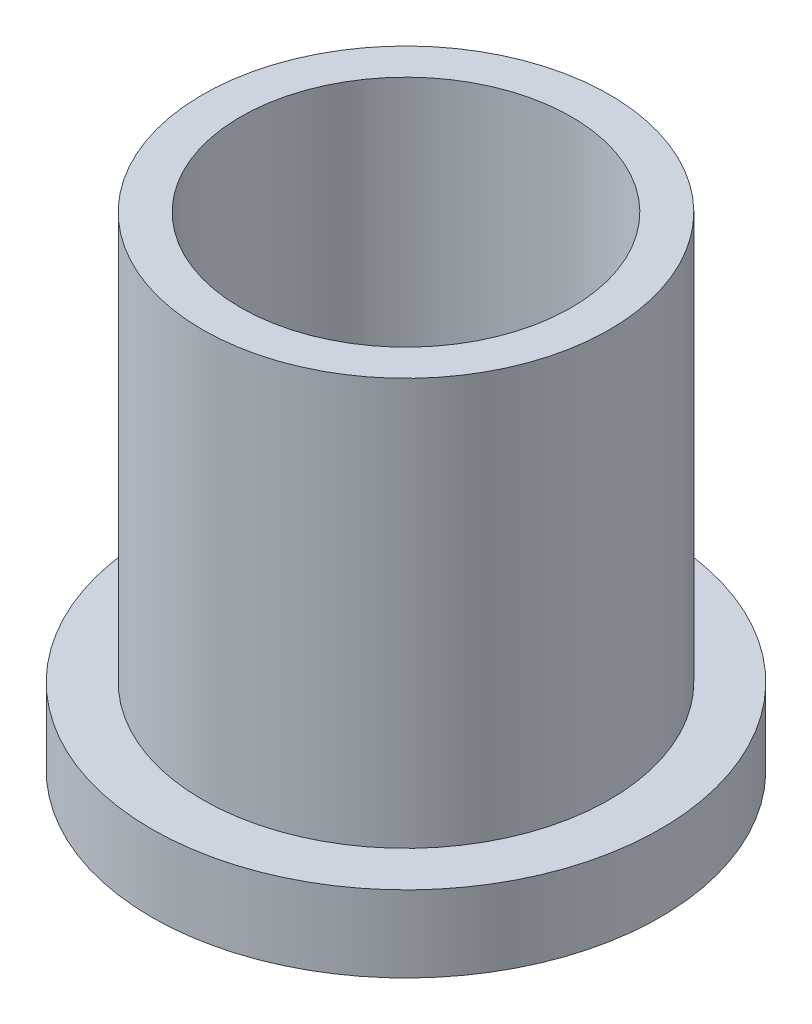
ISO-10303-21;
HEADER;
FILE_DESCRIPTION(('STEP AP214'),'2;1');
FILE_NAME('part.step','',(''),(''),'','','');
FILE_SCHEMA(('AUTOMOTIVE_DESIGN { 1 0 10303 214 1 1 1 1 }'));
ENDSEC;
DATA;
#1=APPLICATION_CONTEXT('core data for automotive mechanical design processes');
#2=APPLICATION_PROTOCOL_DEFINITION('international standard','automotive_design',2000,#1);
#3=PRODUCT_CONTEXT('',#1,'mechanical');
#4=PRODUCT('Part','Part','',(#3));
#5=PRODUCT_RELATED_PRODUCT_CATEGORY('part','',(#4));
#6=PRODUCT_DEFINITION_FORMATION('','',#4);
#7=PRODUCT_DEFINITION_CONTEXT('part definition',#1,'design');
#8=PRODUCT_DEFINITION('design','',#6,#7);
#9=PRODUCT_DEFINITION_SHAPE('','',#8);
#10=(LENGTH_UNIT() NAMED_UNIT(*) SI_UNIT(.MILLI.,.METRE.));
#11=(NAMED_UNIT(*) PLANE_ANGLE_UNIT() SI_UNIT($,.RADIAN.));
#12=(NAMED_UNIT(*) SI_UNIT($,.STERADIAN.) SOLID_ANGLE_UNIT());
#13=UNCERTAINTY_MEASURE_WITH_UNIT(LENGTH_MEASURE(1.E-05),#10,'distance_accuracy_value','');
#14=(GEOMETRIC_REPRESENTATION_CONTEXT(3) GLOBAL_UNCERTAINTY_ASSIGNED_CONTEXT((#13)) GLOBAL_UNIT_ASSIGNED_CONTEXT((#10,
#11,#12)) REPRESENTATION_CONTEXT('',''));
#15=CARTESIAN_POINT('',(0.,0.,0.));
#16=DIRECTION('',(0.,0.,1.));
#17=DIRECTION('',(1.,0.,0.));
#18=AXIS2_PLACEMENT_3D('',#15,#16,#17);
#19=CARTESIAN_POINT('',(0.,3.,0.));
#20=DIRECTION('',(0.,1.,0.));
#21=DIRECTION('',(0.,0.,1.));
#22=AXIS2_PLACEMENT_3D('',#19,#20,#21);
#23=PLANE('',#22);
#24=CARTESIAN_POINT('',(0.,3.,0.));
#25=DIRECTION('',(0.,1.,0.));
#26=DIRECTION('',(0.,0.,1.));
#27=AXIS2_PLACEMENT_3D('',#24,#25,#26);
#28=CIRCLE('',#27,10.);
#29=CARTESIAN_POINT('',(0.,3.,10.));
#30=VERTEX_POINT('',#29);
#31=EDGE_CURVE('E12',#30,#30,#28,.T.);
#32=ORIENTED_EDGE('',*,*,#31,.T.);
#33=EDGE_LOOP('',(#32));
#34=FACE_BOUND('',#33,.T.);
#35=CARTESIAN_POINT('',(0.,3.,0.));
#36=DIRECTION('',(0.,1.,0.));
#37=DIRECTION('',(0.,0.,1.));
#38=AXIS2_PLACEMENT_3D('',#35,#36,#37);
#39=CIRCLE('',#38,8.);
#40=CARTESIAN_POINT('',(0.,3.,8.));
#41=VERTEX_POINT('',#40);
#42=EDGE_CURVE('E62',#41,#41,#39,.T.);
#43=ORIENTED_EDGE('',*,*,#42,.F.);
#44=EDGE_LOOP('',(#43));
#45=FACE_BOUND('',#44,.T.);
#46=ADVANCED_FACE('F46',(#34,#45),#23,.T.);
#47=CARTESIAN_POINT('',(0.,0.,0.));
#48=DIRECTION('',(0.,1.,0.));
#49=DIRECTION('',(0.,0.,1.));
#50=AXIS2_PLACEMENT_3D('',#47,#48,#49);
#51=PLANE('',#50);
#52=CARTESIAN_POINT('',(0.,0.,0.));
#53=DIRECTION('',(0.,1.,0.));
#54=DIRECTION('',(0.,0.,1.));
#55=AXIS2_PLACEMENT_3D('',#52,#53,#54);
#56=CIRCLE('',#55,10.);
#57=CARTESIAN_POINT('',(0.,0.,10.));
#58=VERTEX_POINT('',#57);
#59=EDGE_CURVE('E50',#58,#58,#56,.T.);
#60=ORIENTED_EDGE('',*,*,#59,.F.);
#61=EDGE_LOOP('',(#60));
#62=FACE_BOUND('',#61,.T.);
#63=CARTESIAN_POINT('',(0.,0.,0.));
#64=DIRECTION('',(0.,1.,0.));
#65=DIRECTION('',(0.,0.,1.));
#66=AXIS2_PLACEMENT_3D('',#63,#64,#65);
#67=CIRCLE('',#66,6.5);
#68=CARTESIAN_POINT('',(0.,0.,6.5));
#69=VERTEX_POINT('',#68);
#70=EDGE_CURVE('E57',#69,#69,#67,.T.);
#71=ORIENTED_EDGE('',*,*,#70,.T.);
#72=EDGE_LOOP('',(#71));
#73=FACE_BOUND('',#72,.T.);
#74=ADVANCED_FACE('F87',(#62,#73),#51,.F.);
#75=CARTESIAN_POINT('',(0.,3.,0.));
#76=DIRECTION('',(0.,-1.,0.));
#77=DIRECTION('',(0.,0.,-1.));
#78=AXIS2_PLACEMENT_3D('',#75,#76,#77);
#79=CYLINDRICAL_SURFACE('',#78,10.);
#80=ORIENTED_EDGE('',*,*,#31,.F.);
#81=EDGE_LOOP('',(#80));
#82=FACE_BOUND('',#81,.T.);
#83=ORIENTED_EDGE('',*,*,#59,.T.);
#84=EDGE_LOOP('',(#83));
#85=FACE_BOUND('',#84,.T.);
#86=ADVANCED_FACE('F48',(#82,#85),#79,.T.);
#87=CARTESIAN_POINT('',(0.,3.,0.));
#88=DIRECTION('',(0.,-1.,0.));
#89=DIRECTION('',(0.,0.,-1.));
#90=AXIS2_PLACEMENT_3D('',#87,#88,#89);
#91=CYLINDRICAL_SURFACE('',#90,6.5);
#92=ORIENTED_EDGE('',*,*,#70,.F.);
#93=EDGE_LOOP('',(#92));
#94=FACE_BOUND('',#93,.T.);
#95=CARTESIAN_POINT('',(0.,19.,0.));
#96=DIRECTION('',(0.,1.,0.));
#97=DIRECTION('',(0.,0.,1.));
#98=AXIS2_PLACEMENT_3D('',#95,#96,#97);
#99=CIRCLE('',#98,6.5);
#100=CARTESIAN_POINT('',(0.,19.,6.5));
#101=VERTEX_POINT('',#100);
#102=EDGE_CURVE('E65',#101,#101,#99,.T.);
#103=ORIENTED_EDGE('',*,*,#102,.T.);
#104=EDGE_LOOP('',(#103));
#105=FACE_BOUND('',#104,.T.);
#106=ADVANCED_FACE('F71',(#94,#105),#91,.F.);
#107=CARTESIAN_POINT('',(0.,19.,0.));
#108=DIRECTION('',(0.,1.,0.));
#109=DIRECTION('',(0.,0.,1.));
#110=AXIS2_PLACEMENT_3D('',#107,#108,#109);
#111=PLANE('',#110);
#112=CARTESIAN_POINT('',(0.,19.,0.));
#113=DIRECTION('',(0.,1.,0.));
#114=DIRECTION('',(0.,0.,1.));
#115=AXIS2_PLACEMENT_3D('',#112,#113,#114);
#116=CIRCLE('',#115,8.);
#117=CARTESIAN_POINT('',(0.,19.,8.));
#118=VERTEX_POINT('',#117);
#119=EDGE_CURVE('E61',#118,#118,#116,.T.);
#120=ORIENTED_EDGE('',*,*,#119,.T.);
#121=EDGE_LOOP('',(#120));
#122=FACE_BOUND('',#121,.T.);
#123=ORIENTED_EDGE('',*,*,#102,.F.);
#124=EDGE_LOOP('',(#123));
#125=FACE_BOUND('',#124,.T.);
#126=ADVANCED_FACE('F73',(#122,#125),#111,.T.);
#127=CARTESIAN_POINT('',(0.,19.,0.));
#128=DIRECTION('',(0.,-1.,0.));
#129=DIRECTION('',(0.,0.,-1.));
#130=AXIS2_PLACEMENT_3D('',#127,#128,#129);
#131=CYLINDRICAL_SURFACE('',#130,8.);
#132=ORIENTED_EDGE('',*,*,#119,.F.);
#133=EDGE_LOOP('',(#132));
#134=FACE_BOUND('',#133,.T.);
#135=ORIENTED_EDGE('',*,*,#42,.T.);
#136=EDGE_LOOP('',(#135));
#137=FACE_BOUND('',#136,.T.);
#138=ADVANCED_FACE('F75',(#134,#137),#131,.T.);
#139=CLOSED_SHELL('',(#46,#74,#86,#106,#126,#138));
#140=MANIFOLD_SOLID_BREP('B2',#139);
#141=ADVANCED_BREP_SHAPE_REPRESENTATION('',(#18,#140),#14);
#142=SHAPE_DEFINITION_REPRESENTATION(#9,#141);
ENDSEC;
END-ISO-10303-21;
